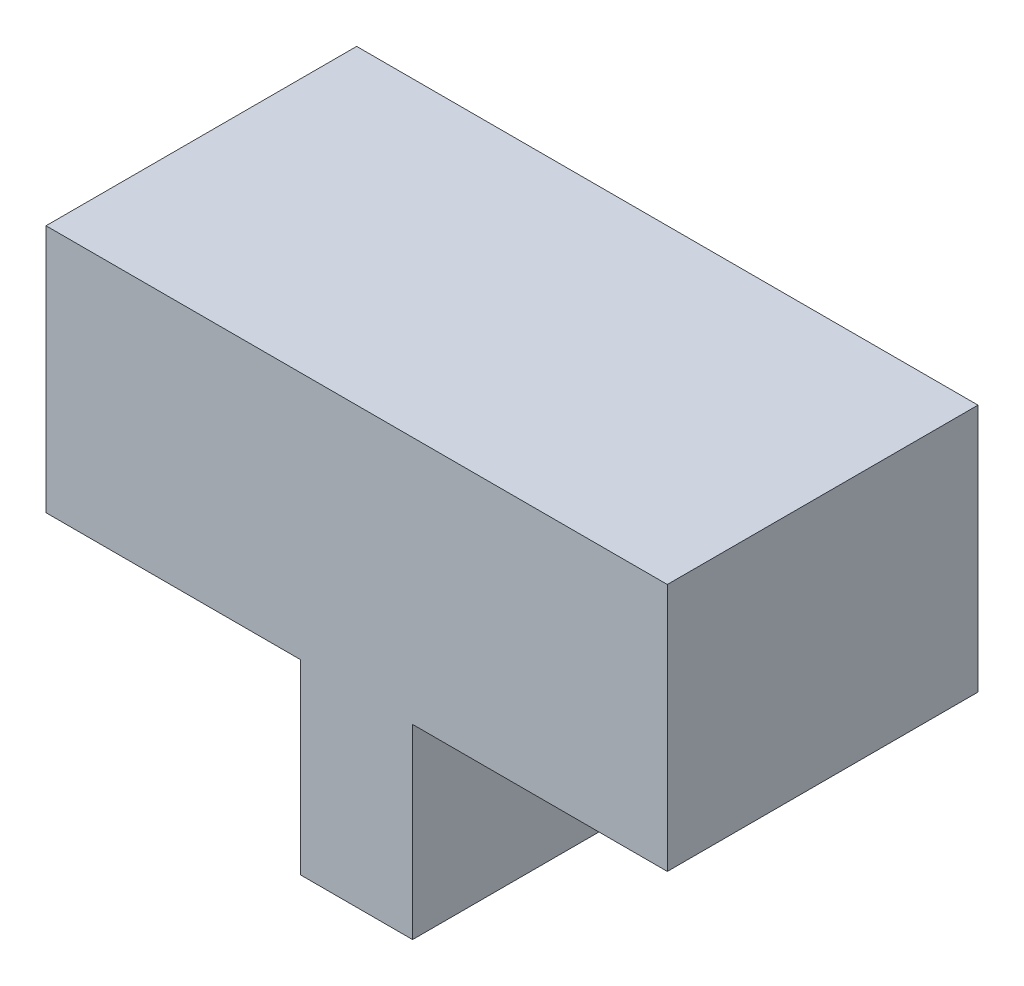
ISO-10303-21;
HEADER;
FILE_DESCRIPTION(('STEP AP214'),'2;1');
FILE_NAME('part.step','',(''),(''),'','','');
FILE_SCHEMA(('AUTOMOTIVE_DESIGN { 1 0 10303 214 1 1 1 1 }'));
ENDSEC;
DATA;
#1=APPLICATION_CONTEXT('core data for automotive mechanical design processes');
#2=APPLICATION_PROTOCOL_DEFINITION('international standard','automotive_design',2000,#1);
#3=PRODUCT_CONTEXT('',#1,'mechanical');
#4=PRODUCT('Part','Part','',(#3));
#5=PRODUCT_RELATED_PRODUCT_CATEGORY('part','',(#4));
#6=PRODUCT_DEFINITION_FORMATION('','',#4);
#7=PRODUCT_DEFINITION_CONTEXT('part definition',#1,'design');
#8=PRODUCT_DEFINITION('design','',#6,#7);
#9=PRODUCT_DEFINITION_SHAPE('','',#8);
#10=(LENGTH_UNIT() NAMED_UNIT(*) SI_UNIT(.MILLI.,.METRE.));
#11=(NAMED_UNIT(*) PLANE_ANGLE_UNIT() SI_UNIT($,.RADIAN.));
#12=(NAMED_UNIT(*) SI_UNIT($,.STERADIAN.) SOLID_ANGLE_UNIT());
#13=UNCERTAINTY_MEASURE_WITH_UNIT(LENGTH_MEASURE(1.E-05),#10,'distance_accuracy_value','');
#14=(GEOMETRIC_REPRESENTATION_CONTEXT(3) GLOBAL_UNCERTAINTY_ASSIGNED_CONTEXT((#13)) GLOBAL_UNIT_ASSIGNED_CONTEXT((#10,
#11,#12)) REPRESENTATION_CONTEXT('',''));
#15=CARTESIAN_POINT('',(0.,0.,0.));
#16=DIRECTION('',(0.,0.,1.));
#17=DIRECTION('',(1.,0.,0.));
#18=AXIS2_PLACEMENT_3D('',#15,#16,#17);
#19=CARTESIAN_POINT('',(-10.,9.5,10.));
#20=DIRECTION('',(0.,1.,0.));
#21=DIRECTION('',(0.,0.,1.));
#22=AXIS2_PLACEMENT_3D('',#19,#20,#21);
#23=PLANE('',#22);
#24=DIRECTION('',(1.,0.,0.));
#25=VECTOR('',#24,1.);
#26=CARTESIAN_POINT('',(-10.,9.5,0.));
#27=LINE('',#26,#25);
#28=CARTESIAN_POINT('',(-10.,9.5,0.));
#29=VERTEX_POINT('',#28);
#30=CARTESIAN_POINT('',(-1.8,9.5,0.));
#31=VERTEX_POINT('',#30);
#32=EDGE_CURVE('E133',#29,#31,#27,.T.);
#33=ORIENTED_EDGE('',*,*,#32,.T.);
#34=DIRECTION('',(0.,0.,-1.));
#35=VECTOR('',#34,1.);
#36=CARTESIAN_POINT('',(-1.8,9.5,10.));
#37=LINE('',#36,#35);
#38=CARTESIAN_POINT('',(-1.8,9.5,10.));
#39=VERTEX_POINT('',#38);
#40=EDGE_CURVE('E11',#39,#31,#37,.T.);
#41=ORIENTED_EDGE('',*,*,#40,.F.);
#42=DIRECTION('',(1.,0.,0.));
#43=VECTOR('',#42,1.);
#44=CARTESIAN_POINT('',(-10.,9.5,10.));
#45=LINE('',#44,#43);
#46=CARTESIAN_POINT('',(-10.,9.5,10.));
#47=VERTEX_POINT('',#46);
#48=EDGE_CURVE('E147',#47,#39,#45,.T.);
#49=ORIENTED_EDGE('',*,*,#48,.F.);
#50=DIRECTION('',(0.,0.,-1.));
#51=VECTOR('',#50,1.);
#52=CARTESIAN_POINT('',(-10.,9.5,10.));
#53=LINE('',#52,#51);
#54=EDGE_CURVE('E129',#47,#29,#53,.T.);
#55=ORIENTED_EDGE('',*,*,#54,.T.);
#56=EDGE_LOOP('',(#33,#41,#49,#55));
#57=FACE_BOUND('',#56,.T.);
#58=ADVANCED_FACE('F37',(#57),#23,.F.);
#59=CARTESIAN_POINT('',(-1.8,9.5,10.));
#60=DIRECTION('',(1.,0.,0.));
#61=DIRECTION('',(0.,0.,-1.));
#62=AXIS2_PLACEMENT_3D('',#59,#60,#61);
#63=PLANE('',#62);
#64=DIRECTION('',(0.,-1.,0.));
#65=VECTOR('',#64,1.);
#66=CARTESIAN_POINT('',(-1.8,9.5,0.));
#67=LINE('',#66,#65);
#68=CARTESIAN_POINT('',(-1.8,3.5,0.));
#69=VERTEX_POINT('',#68);
#70=EDGE_CURVE('E136',#31,#69,#67,.T.);
#71=ORIENTED_EDGE('',*,*,#70,.T.);
#72=DIRECTION('',(0.,0.,-1.));
#73=VECTOR('',#72,1.);
#74=CARTESIAN_POINT('',(-1.8,3.5,10.));
#75=LINE('',#74,#73);
#76=CARTESIAN_POINT('',(-1.8,3.5,10.));
#77=VERTEX_POINT('',#76);
#78=EDGE_CURVE('E45',#77,#69,#75,.T.);
#79=ORIENTED_EDGE('',*,*,#78,.F.);
#80=DIRECTION('',(0.,-1.,0.));
#81=VECTOR('',#80,1.);
#82=CARTESIAN_POINT('',(-1.8,9.5,10.));
#83=LINE('',#82,#81);
#84=EDGE_CURVE('E96',#39,#77,#83,.T.);
#85=ORIENTED_EDGE('',*,*,#84,.F.);
#86=ORIENTED_EDGE('',*,*,#40,.T.);
#87=EDGE_LOOP('',(#71,#79,#85,#86));
#88=FACE_BOUND('',#87,.T.);
#89=ADVANCED_FACE('F182',(#88),#63,.F.);
#90=CARTESIAN_POINT('',(-1.8,3.5,10.));
#91=DIRECTION('',(0.,1.,0.));
#92=DIRECTION('',(0.,0.,1.));
#93=AXIS2_PLACEMENT_3D('',#90,#91,#92);
#94=PLANE('',#93);
#95=DIRECTION('',(1.,0.,0.));
#96=VECTOR('',#95,1.);
#97=CARTESIAN_POINT('',(-1.8,3.5,0.));
#98=LINE('',#97,#96);
#99=CARTESIAN_POINT('',(1.8,3.5,0.));
#100=VERTEX_POINT('',#99);
#101=EDGE_CURVE('E138',#69,#100,#98,.T.);
#102=ORIENTED_EDGE('',*,*,#101,.T.);
#103=DIRECTION('',(0.,0.,-1.));
#104=VECTOR('',#103,1.);
#105=CARTESIAN_POINT('',(1.8,3.5,10.));
#106=LINE('',#105,#104);
#107=CARTESIAN_POINT('',(1.8,3.5,10.));
#108=VERTEX_POINT('',#107);
#109=EDGE_CURVE('E154',#108,#100,#106,.T.);
#110=ORIENTED_EDGE('',*,*,#109,.F.);
#111=DIRECTION('',(1.,0.,0.));
#112=VECTOR('',#111,1.);
#113=CARTESIAN_POINT('',(-1.8,3.5,10.));
#114=LINE('',#113,#112);
#115=EDGE_CURVE('E162',#77,#108,#114,.T.);
#116=ORIENTED_EDGE('',*,*,#115,.F.);
#117=ORIENTED_EDGE('',*,*,#78,.T.);
#118=EDGE_LOOP('',(#102,#110,#116,#117));
#119=FACE_BOUND('',#118,.T.);
#120=ADVANCED_FACE('F160',(#119),#94,.F.);
#121=CARTESIAN_POINT('',(1.8,9.5,10.));
#122=DIRECTION('',(-1.,0.,0.));
#123=DIRECTION('',(0.,0.,1.));
#124=AXIS2_PLACEMENT_3D('',#121,#122,#123);
#125=PLANE('',#124);
#126=DIRECTION('',(0.,1.,0.));
#127=VECTOR('',#126,1.);
#128=CARTESIAN_POINT('',(1.8,9.5,0.));
#129=LINE('',#128,#127);
#130=CARTESIAN_POINT('',(1.8,9.5,0.));
#131=VERTEX_POINT('',#130);
#132=EDGE_CURVE('E140',#100,#131,#129,.T.);
#133=ORIENTED_EDGE('',*,*,#132,.T.);
#134=DIRECTION('',(0.,0.,-1.));
#135=VECTOR('',#134,1.);
#136=CARTESIAN_POINT('',(1.8,9.5,10.));
#137=LINE('',#136,#135);
#138=CARTESIAN_POINT('',(1.8,9.5,10.));
#139=VERTEX_POINT('',#138);
#140=EDGE_CURVE('E151',#139,#131,#137,.T.);
#141=ORIENTED_EDGE('',*,*,#140,.F.);
#142=DIRECTION('',(0.,1.,0.));
#143=VECTOR('',#142,1.);
#144=CARTESIAN_POINT('',(1.8,9.5,10.));
#145=LINE('',#144,#143);
#146=EDGE_CURVE('E174',#108,#139,#145,.T.);
#147=ORIENTED_EDGE('',*,*,#146,.F.);
#148=ORIENTED_EDGE('',*,*,#109,.T.);
#149=EDGE_LOOP('',(#133,#141,#147,#148));
#150=FACE_BOUND('',#149,.T.);
#151=ADVANCED_FACE('F170',(#150),#125,.F.);
#152=CARTESIAN_POINT('',(10.,9.5,10.));
#153=DIRECTION('',(0.,1.,0.));
#154=DIRECTION('',(0.,0.,1.));
#155=AXIS2_PLACEMENT_3D('',#152,#153,#154);
#156=PLANE('',#155);
#157=DIRECTION('',(1.,0.,0.));
#158=VECTOR('',#157,1.);
#159=CARTESIAN_POINT('',(10.,9.5,0.));
#160=LINE('',#159,#158);
#161=CARTESIAN_POINT('',(10.,9.5,0.));
#162=VERTEX_POINT('',#161);
#163=EDGE_CURVE('E142',#131,#162,#160,.T.);
#164=ORIENTED_EDGE('',*,*,#163,.T.);
#165=DIRECTION('',(0.,0.,-1.));
#166=VECTOR('',#165,1.);
#167=CARTESIAN_POINT('',(10.,9.5,10.));
#168=LINE('',#167,#166);
#169=CARTESIAN_POINT('',(10.,9.5,10.));
#170=VERTEX_POINT('',#169);
#171=EDGE_CURVE('E124',#170,#162,#168,.T.);
#172=ORIENTED_EDGE('',*,*,#171,.F.);
#173=DIRECTION('',(1.,0.,0.));
#174=VECTOR('',#173,1.);
#175=CARTESIAN_POINT('',(10.,9.5,10.));
#176=LINE('',#175,#174);
#177=EDGE_CURVE('E115',#139,#170,#176,.T.);
#178=ORIENTED_EDGE('',*,*,#177,.F.);
#179=ORIENTED_EDGE('',*,*,#140,.T.);
#180=EDGE_LOOP('',(#164,#172,#178,#179));
#181=FACE_BOUND('',#180,.T.);
#182=ADVANCED_FACE('F173',(#181),#156,.F.);
#183=CARTESIAN_POINT('',(10.,17.5,10.));
#184=DIRECTION('',(-1.,0.,0.));
#185=DIRECTION('',(0.,-1.,0.));
#186=AXIS2_PLACEMENT_3D('',#183,#184,#185);
#187=PLANE('',#186);
#188=DIRECTION('',(0.,1.,0.));
#189=VECTOR('',#188,1.);
#190=CARTESIAN_POINT('',(10.,17.5,0.));
#191=LINE('',#190,#189);
#192=CARTESIAN_POINT('',(10.,17.5,0.));
#193=VERTEX_POINT('',#192);
#194=EDGE_CURVE('E123',#162,#193,#191,.T.);
#195=ORIENTED_EDGE('',*,*,#194,.T.);
#196=DIRECTION('',(0.,0.,-1.));
#197=VECTOR('',#196,1.);
#198=CARTESIAN_POINT('',(10.,17.5,10.));
#199=LINE('',#198,#197);
#200=CARTESIAN_POINT('',(10.,17.5,10.));
#201=VERTEX_POINT('',#200);
#202=EDGE_CURVE('E120',#201,#193,#199,.T.);
#203=ORIENTED_EDGE('',*,*,#202,.F.);
#204=DIRECTION('',(0.,1.,0.));
#205=VECTOR('',#204,1.);
#206=CARTESIAN_POINT('',(10.,17.5,10.));
#207=LINE('',#206,#205);
#208=EDGE_CURVE('E109',#170,#201,#207,.T.);
#209=ORIENTED_EDGE('',*,*,#208,.F.);
#210=ORIENTED_EDGE('',*,*,#171,.T.);
#211=EDGE_LOOP('',(#195,#203,#209,#210));
#212=FACE_BOUND('',#211,.T.);
#213=ADVANCED_FACE('F121',(#212),#187,.F.);
#214=CARTESIAN_POINT('',(10.,17.5,10.));
#215=DIRECTION('',(0.,-1.,0.));
#216=DIRECTION('',(0.,0.,-1.));
#217=AXIS2_PLACEMENT_3D('',#214,#215,#216);
#218=PLANE('',#217);
#219=DIRECTION('',(-1.,0.,0.));
#220=VECTOR('',#219,1.);
#221=CARTESIAN_POINT('',(10.,17.5,0.));
#222=LINE('',#221,#220);
#223=CARTESIAN_POINT('',(-10.,17.5,0.));
#224=VERTEX_POINT('',#223);
#225=EDGE_CURVE('E82',#193,#224,#222,.T.);
#226=ORIENTED_EDGE('',*,*,#225,.T.);
#227=DIRECTION('',(0.,0.,-1.));
#228=VECTOR('',#227,1.);
#229=CARTESIAN_POINT('',(-10.,17.5,10.));
#230=LINE('',#229,#228);
#231=CARTESIAN_POINT('',(-10.,17.5,10.));
#232=VERTEX_POINT('',#231);
#233=EDGE_CURVE('E125',#232,#224,#230,.T.);
#234=ORIENTED_EDGE('',*,*,#233,.F.);
#235=DIRECTION('',(-1.,0.,0.));
#236=VECTOR('',#235,1.);
#237=CARTESIAN_POINT('',(10.,17.5,10.));
#238=LINE('',#237,#236);
#239=EDGE_CURVE('E113',#201,#232,#238,.T.);
#240=ORIENTED_EDGE('',*,*,#239,.F.);
#241=ORIENTED_EDGE('',*,*,#202,.T.);
#242=EDGE_LOOP('',(#226,#234,#240,#241));
#243=FACE_BOUND('',#242,.T.);
#244=ADVANCED_FACE('F127',(#243),#218,.F.);
#245=CARTESIAN_POINT('',(-10.,17.5,10.));
#246=DIRECTION('',(1.,0.,0.));
#247=DIRECTION('',(0.,1.,0.));
#248=AXIS2_PLACEMENT_3D('',#245,#246,#247);
#249=PLANE('',#248);
#250=DIRECTION('',(0.,-1.,0.));
#251=VECTOR('',#250,1.);
#252=CARTESIAN_POINT('',(-10.,17.5,0.));
#253=LINE('',#252,#251);
#254=EDGE_CURVE('E88',#224,#29,#253,.T.);
#255=ORIENTED_EDGE('',*,*,#254,.T.);
#256=ORIENTED_EDGE('',*,*,#54,.F.);
#257=DIRECTION('',(0.,-1.,0.));
#258=VECTOR('',#257,1.);
#259=CARTESIAN_POINT('',(-10.,17.5,10.));
#260=LINE('',#259,#258);
#261=EDGE_CURVE('E53',#232,#47,#260,.T.);
#262=ORIENTED_EDGE('',*,*,#261,.F.);
#263=ORIENTED_EDGE('',*,*,#233,.T.);
#264=EDGE_LOOP('',(#255,#256,#262,#263));
#265=FACE_BOUND('',#264,.T.);
#266=ADVANCED_FACE('F198',(#265),#249,.F.);
#267=CARTESIAN_POINT('',(0.,0.,10.));
#268=DIRECTION('',(0.,0.,-1.));
#269=DIRECTION('',(-1.,0.,0.));
#270=AXIS2_PLACEMENT_3D('',#267,#268,#269);
#271=PLANE('',#270);
#272=ORIENTED_EDGE('',*,*,#48,.T.);
#273=ORIENTED_EDGE('',*,*,#84,.T.);
#274=ORIENTED_EDGE('',*,*,#115,.T.);
#275=ORIENTED_EDGE('',*,*,#146,.T.);
#276=ORIENTED_EDGE('',*,*,#177,.T.);
#277=ORIENTED_EDGE('',*,*,#208,.T.);
#278=ORIENTED_EDGE('',*,*,#239,.T.);
#279=ORIENTED_EDGE('',*,*,#261,.T.);
#280=EDGE_LOOP('',(#272,#273,#274,#275,#276,#277,#278,#279));
#281=FACE_BOUND('',#280,.T.);
#282=ADVANCED_FACE('F111',(#281),#271,.F.);
#283=CARTESIAN_POINT('',(0.,0.,0.));
#284=DIRECTION('',(0.,0.,-1.));
#285=DIRECTION('',(-1.,0.,0.));
#286=AXIS2_PLACEMENT_3D('',#283,#284,#285);
#287=PLANE('',#286);
#288=ORIENTED_EDGE('',*,*,#32,.F.);
#289=ORIENTED_EDGE('',*,*,#254,.F.);
#290=ORIENTED_EDGE('',*,*,#225,.F.);
#291=ORIENTED_EDGE('',*,*,#194,.F.);
#292=ORIENTED_EDGE('',*,*,#163,.F.);
#293=ORIENTED_EDGE('',*,*,#132,.F.);
#294=ORIENTED_EDGE('',*,*,#101,.F.);
#295=ORIENTED_EDGE('',*,*,#70,.F.);
#296=EDGE_LOOP('',(#288,#289,#290,#291,#292,#293,#294,#295));
#297=FACE_BOUND('',#296,.T.);
#298=ADVANCED_FACE('F166',(#297),#287,.T.);
#299=CLOSED_SHELL('',(#58,#89,#120,#151,#182,#213,#244,#266,#282,#298));
#300=MANIFOLD_SOLID_BREP('B2',#299);
#301=ADVANCED_BREP_SHAPE_REPRESENTATION('',(#18,#300),#14);
#302=SHAPE_DEFINITION_REPRESENTATION(#9,#301);
ENDSEC;
END-ISO-10303-21;
